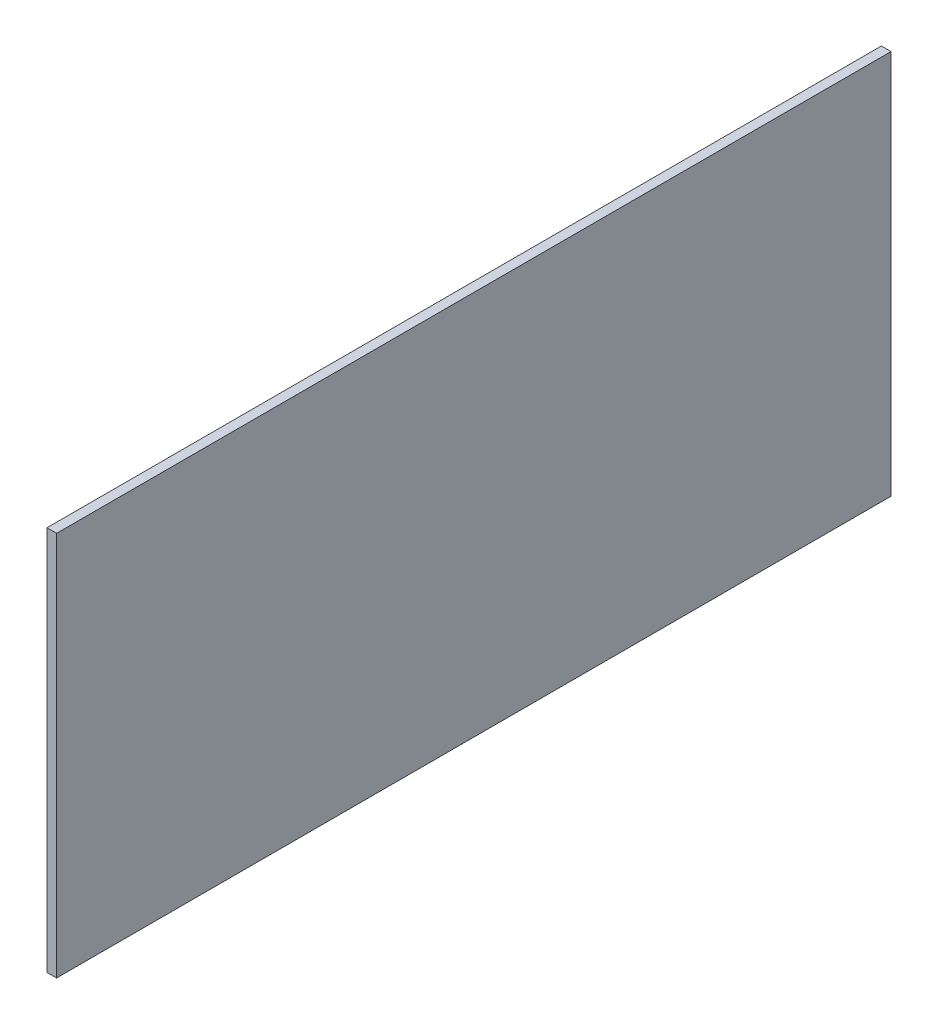
ISO-10303-21;
HEADER;
FILE_DESCRIPTION(('STEP AP214'),'2;1');
FILE_NAME('part.step','',(''),(''),'','','');
FILE_SCHEMA(('AUTOMOTIVE_DESIGN { 1 0 10303 214 1 1 1 1 }'));
ENDSEC;
DATA;
#1=APPLICATION_CONTEXT('core data for automotive mechanical design processes');
#2=APPLICATION_PROTOCOL_DEFINITION('international standard','automotive_design',2000,#1);
#3=PRODUCT_CONTEXT('',#1,'mechanical');
#4=PRODUCT('Part','Part','',(#3));
#5=PRODUCT_RELATED_PRODUCT_CATEGORY('part','',(#4));
#6=PRODUCT_DEFINITION_FORMATION('','',#4);
#7=PRODUCT_DEFINITION_CONTEXT('part definition',#1,'design');
#8=PRODUCT_DEFINITION('design','',#6,#7);
#9=PRODUCT_DEFINITION_SHAPE('','',#8);
#10=(LENGTH_UNIT() NAMED_UNIT(*) SI_UNIT(.MILLI.,.METRE.));
#11=(NAMED_UNIT(*) PLANE_ANGLE_UNIT() SI_UNIT($,.RADIAN.));
#12=(NAMED_UNIT(*) SI_UNIT($,.STERADIAN.) SOLID_ANGLE_UNIT());
#13=UNCERTAINTY_MEASURE_WITH_UNIT(LENGTH_MEASURE(1.E-05),#10,'distance_accuracy_value','');
#14=(GEOMETRIC_REPRESENTATION_CONTEXT(3) GLOBAL_UNCERTAINTY_ASSIGNED_CONTEXT((#13)) GLOBAL_UNIT_ASSIGNED_CONTEXT((#10,
#11,#12)) REPRESENTATION_CONTEXT('',''));
#15=CARTESIAN_POINT('',(0.,0.,0.));
#16=DIRECTION('',(0.,0.,1.));
#17=DIRECTION('',(1.,0.,0.));
#18=AXIS2_PLACEMENT_3D('',#15,#16,#17);
#19=CARTESIAN_POINT('',(15.,300.,-650.));
#20=DIRECTION('',(0.,-1.,0.));
#21=DIRECTION('',(0.,0.,-1.));
#22=AXIS2_PLACEMENT_3D('',#19,#20,#21);
#23=PLANE('',#22);
#24=DIRECTION('',(0.,0.,1.));
#25=VECTOR('',#24,1.);
#26=CARTESIAN_POINT('',(0.,300.,-650.));
#27=LINE('',#26,#25);
#28=CARTESIAN_POINT('',(0.,300.,-650.));
#29=VERTEX_POINT('',#28);
#30=CARTESIAN_POINT('',(0.,300.,650.));
#31=VERTEX_POINT('',#30);
#32=EDGE_CURVE('E113',#29,#31,#27,.T.);
#33=ORIENTED_EDGE('',*,*,#32,.T.);
#34=DIRECTION('',(-1.,0.,0.));
#35=VECTOR('',#34,1.);
#36=CARTESIAN_POINT('',(15.,300.,650.));
#37=LINE('',#36,#35);
#38=CARTESIAN_POINT('',(15.,300.,650.));
#39=VERTEX_POINT('',#38);
#40=EDGE_CURVE('E11',#39,#31,#37,.T.);
#41=ORIENTED_EDGE('',*,*,#40,.F.);
#42=DIRECTION('',(0.,0.,1.));
#43=VECTOR('',#42,1.);
#44=CARTESIAN_POINT('',(15.,300.,-650.));
#45=LINE('',#44,#43);
#46=CARTESIAN_POINT('',(15.,300.,-650.));
#47=VERTEX_POINT('',#46);
#48=EDGE_CURVE('E97',#47,#39,#45,.T.);
#49=ORIENTED_EDGE('',*,*,#48,.F.);
#50=DIRECTION('',(-1.,0.,0.));
#51=VECTOR('',#50,1.);
#52=CARTESIAN_POINT('',(15.,300.,-650.));
#53=LINE('',#52,#51);
#54=EDGE_CURVE('E109',#47,#29,#53,.T.);
#55=ORIENTED_EDGE('',*,*,#54,.T.);
#56=EDGE_LOOP('',(#33,#41,#49,#55));
#57=FACE_BOUND('',#56,.T.);
#58=ADVANCED_FACE('F45',(#57),#23,.F.);
#59=CARTESIAN_POINT('',(15.,-300.,650.));
#60=DIRECTION('',(0.,0.,-1.));
#61=DIRECTION('',(-1.,0.,0.));
#62=AXIS2_PLACEMENT_3D('',#59,#60,#61);
#63=PLANE('',#62);
#64=DIRECTION('',(0.,-1.,0.));
#65=VECTOR('',#64,1.);
#66=CARTESIAN_POINT('',(0.,-300.,650.));
#67=LINE('',#66,#65);
#68=CARTESIAN_POINT('',(0.,-300.,650.));
#69=VERTEX_POINT('',#68);
#70=EDGE_CURVE('E102',#31,#69,#67,.T.);
#71=ORIENTED_EDGE('',*,*,#70,.T.);
#72=DIRECTION('',(-1.,0.,0.));
#73=VECTOR('',#72,1.);
#74=CARTESIAN_POINT('',(15.,-300.,650.));
#75=LINE('',#74,#73);
#76=CARTESIAN_POINT('',(15.,-300.,650.));
#77=VERTEX_POINT('',#76);
#78=EDGE_CURVE('E54',#77,#69,#75,.T.);
#79=ORIENTED_EDGE('',*,*,#78,.F.);
#80=DIRECTION('',(0.,-1.,0.));
#81=VECTOR('',#80,1.);
#82=CARTESIAN_POINT('',(15.,-300.,650.));
#83=LINE('',#82,#81);
#84=EDGE_CURVE('E92',#39,#77,#83,.T.);
#85=ORIENTED_EDGE('',*,*,#84,.F.);
#86=ORIENTED_EDGE('',*,*,#40,.T.);
#87=EDGE_LOOP('',(#71,#79,#85,#86));
#88=FACE_BOUND('',#87,.T.);
#89=ADVANCED_FACE('F101',(#88),#63,.F.);
#90=CARTESIAN_POINT('',(15.,-300.,-650.));
#91=DIRECTION('',(0.,1.,0.));
#92=DIRECTION('',(0.,0.,1.));
#93=AXIS2_PLACEMENT_3D('',#90,#91,#92);
#94=PLANE('',#93);
#95=DIRECTION('',(0.,0.,-1.));
#96=VECTOR('',#95,1.);
#97=CARTESIAN_POINT('',(0.,-300.,-650.));
#98=LINE('',#97,#96);
#99=CARTESIAN_POINT('',(0.,-300.,-650.));
#100=VERTEX_POINT('',#99);
#101=EDGE_CURVE('E79',#69,#100,#98,.T.);
#102=ORIENTED_EDGE('',*,*,#101,.T.);
#103=DIRECTION('',(-1.,0.,0.));
#104=VECTOR('',#103,1.);
#105=CARTESIAN_POINT('',(15.,-300.,-650.));
#106=LINE('',#105,#104);
#107=CARTESIAN_POINT('',(15.,-300.,-650.));
#108=VERTEX_POINT('',#107);
#109=EDGE_CURVE('E104',#108,#100,#106,.T.);
#110=ORIENTED_EDGE('',*,*,#109,.F.);
#111=DIRECTION('',(0.,0.,-1.));
#112=VECTOR('',#111,1.);
#113=CARTESIAN_POINT('',(15.,-300.,-650.));
#114=LINE('',#113,#112);
#115=EDGE_CURVE('E95',#77,#108,#114,.T.);
#116=ORIENTED_EDGE('',*,*,#115,.F.);
#117=ORIENTED_EDGE('',*,*,#78,.T.);
#118=EDGE_LOOP('',(#102,#110,#116,#117));
#119=FACE_BOUND('',#118,.T.);
#120=ADVANCED_FACE('F105',(#119),#94,.F.);
#121=CARTESIAN_POINT('',(15.,-300.,-650.));
#122=DIRECTION('',(0.,0.,1.));
#123=DIRECTION('',(1.,0.,0.));
#124=AXIS2_PLACEMENT_3D('',#121,#122,#123);
#125=PLANE('',#124);
#126=DIRECTION('',(0.,1.,0.));
#127=VECTOR('',#126,1.);
#128=CARTESIAN_POINT('',(0.,-300.,-650.));
#129=LINE('',#128,#127);
#130=EDGE_CURVE('E85',#100,#29,#129,.T.);
#131=ORIENTED_EDGE('',*,*,#130,.T.);
#132=ORIENTED_EDGE('',*,*,#54,.F.);
#133=DIRECTION('',(0.,1.,0.));
#134=VECTOR('',#133,1.);
#135=CARTESIAN_POINT('',(15.,-300.,-650.));
#136=LINE('',#135,#134);
#137=EDGE_CURVE('E62',#108,#47,#136,.T.);
#138=ORIENTED_EDGE('',*,*,#137,.F.);
#139=ORIENTED_EDGE('',*,*,#109,.T.);
#140=EDGE_LOOP('',(#131,#132,#138,#139));
#141=FACE_BOUND('',#140,.T.);
#142=ADVANCED_FACE('F126',(#141),#125,.F.);
#143=CARTESIAN_POINT('',(15.,0.,0.));
#144=DIRECTION('',(-1.,0.,0.));
#145=DIRECTION('',(0.,0.,1.));
#146=AXIS2_PLACEMENT_3D('',#143,#144,#145);
#147=PLANE('',#146);
#148=ORIENTED_EDGE('',*,*,#48,.T.);
#149=ORIENTED_EDGE('',*,*,#84,.T.);
#150=ORIENTED_EDGE('',*,*,#115,.T.);
#151=ORIENTED_EDGE('',*,*,#137,.T.);
#152=EDGE_LOOP('',(#148,#149,#150,#151));
#153=FACE_BOUND('',#152,.T.);
#154=ADVANCED_FACE('F93',(#153),#147,.F.);
#155=CARTESIAN_POINT('',(0.,0.,0.));
#156=DIRECTION('',(-1.,0.,0.));
#157=DIRECTION('',(0.,0.,1.));
#158=AXIS2_PLACEMENT_3D('',#155,#156,#157);
#159=PLANE('',#158);
#160=ORIENTED_EDGE('',*,*,#32,.F.);
#161=ORIENTED_EDGE('',*,*,#130,.F.);
#162=ORIENTED_EDGE('',*,*,#101,.F.);
#163=ORIENTED_EDGE('',*,*,#70,.F.);
#164=EDGE_LOOP('',(#160,#161,#162,#163));
#165=FACE_BOUND('',#164,.T.);
#166=ADVANCED_FACE('F129',(#165),#159,.T.);
#167=CLOSED_SHELL('',(#58,#89,#120,#142,#154,#166));
#168=MANIFOLD_SOLID_BREP('B2',#167);
#169=ADVANCED_BREP_SHAPE_REPRESENTATION('',(#18,#168),#14);
#170=SHAPE_DEFINITION_REPRESENTATION(#9,#169);
ENDSEC;
END-ISO-10303-21;
